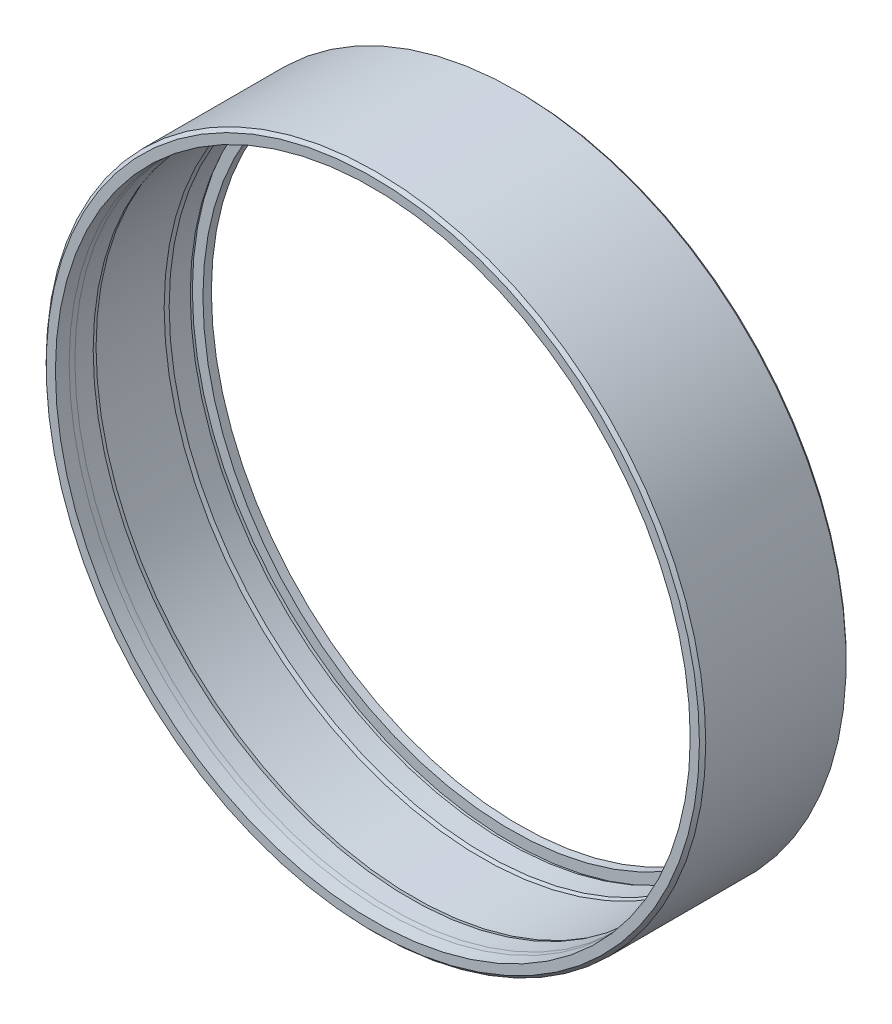
ISO-10303-21;
HEADER;
FILE_DESCRIPTION(('STEP AP214'),'2;1');
FILE_NAME('part.step','',(''),(''),'','','');
FILE_SCHEMA(('AUTOMOTIVE_DESIGN { 1 0 10303 214 1 1 1 1 }'));
ENDSEC;
DATA;
#1=APPLICATION_CONTEXT('core data for automotive mechanical design processes');
#2=APPLICATION_PROTOCOL_DEFINITION('international standard','automotive_design',2000,#1);
#3=PRODUCT_CONTEXT('',#1,'mechanical');
#4=PRODUCT('Part','Part','',(#3));
#5=PRODUCT_RELATED_PRODUCT_CATEGORY('part','',(#4));
#6=PRODUCT_DEFINITION_FORMATION('','',#4);
#7=PRODUCT_DEFINITION_CONTEXT('part definition',#1,'design');
#8=PRODUCT_DEFINITION('design','',#6,#7);
#9=PRODUCT_DEFINITION_SHAPE('','',#8);
#10=(LENGTH_UNIT() NAMED_UNIT(*) SI_UNIT(.MILLI.,.METRE.));
#11=(NAMED_UNIT(*) PLANE_ANGLE_UNIT() SI_UNIT($,.RADIAN.));
#12=(NAMED_UNIT(*) SI_UNIT($,.STERADIAN.) SOLID_ANGLE_UNIT());
#13=UNCERTAINTY_MEASURE_WITH_UNIT(LENGTH_MEASURE(1.E-05),#10,'distance_accuracy_value','');
#14=(GEOMETRIC_REPRESENTATION_CONTEXT(3) GLOBAL_UNCERTAINTY_ASSIGNED_CONTEXT((#13)) GLOBAL_UNIT_ASSIGNED_CONTEXT((#10,
#11,#12)) REPRESENTATION_CONTEXT('',''));
#15=CARTESIAN_POINT('',(0.,0.,0.));
#16=DIRECTION('',(0.,0.,1.));
#17=DIRECTION('',(1.,0.,0.));
#18=AXIS2_PLACEMENT_3D('',#15,#16,#17);
#19=CARTESIAN_POINT('',(0.,0.,-88.9900000000239));
#20=DIRECTION('',(0.,0.,-1.));
#21=DIRECTION('',(-1.,0.,0.));
#22=AXIS2_PLACEMENT_3D('',#19,#20,#21);
#23=CYLINDRICAL_SURFACE('',#22,30.1);
#24=CARTESIAN_POINT('',(0.,0.,-27.3267949192431));
#25=DIRECTION('',(0.,0.,-1.));
#26=DIRECTION('',(-1.,0.,0.));
#27=AXIS2_PLACEMENT_3D('',#24,#25,#26);
#28=CIRCLE('',#27,30.1);
#29=CARTESIAN_POINT('',(-30.1,0.,-27.3267949192431));
#30=VERTEX_POINT('',#29);
#31=EDGE_CURVE('E75',#30,#30,#28,.T.);
#32=ORIENTED_EDGE('',*,*,#31,.T.);
#33=EDGE_LOOP('',(#32));
#34=FACE_BOUND('',#33,.T.);
#35=CARTESIAN_POINT('',(0.,0.,-20.8732050807569));
#36=DIRECTION('',(0.,0.,-1.));
#37=DIRECTION('',(-1.,0.,0.));
#38=AXIS2_PLACEMENT_3D('',#35,#36,#37);
#39=CIRCLE('',#38,30.1);
#40=CARTESIAN_POINT('',(-30.1,0.,-20.8732050807569));
#41=VERTEX_POINT('',#40);
#42=EDGE_CURVE('E111',#41,#41,#39,.T.);
#43=ORIENTED_EDGE('',*,*,#42,.F.);
#44=EDGE_LOOP('',(#43));
#45=FACE_BOUND('',#44,.T.);
#46=ADVANCED_FACE('F41',(#34,#45),#23,.F.);
#47=CARTESIAN_POINT('',(0.,0.,-27.3267949192431));
#48=DIRECTION('',(0.,0.,1.));
#49=DIRECTION('',(1.,0.,0.));
#50=AXIS2_PLACEMENT_3D('',#47,#48,#49);
#51=CONICAL_SURFACE('',#50,30.1,0.261799387799147);
#52=CARTESIAN_POINT('',(0.,0.,-27.7));
#53=DIRECTION('',(0.,0.,-1.));
#54=DIRECTION('',(-1.,0.,0.));
#55=AXIS2_PLACEMENT_3D('',#52,#53,#54);
#56=CIRCLE('',#55,30.);
#57=CARTESIAN_POINT('',(-30.,0.,-27.7));
#58=VERTEX_POINT('',#57);
#59=EDGE_CURVE('E79',#58,#58,#56,.T.);
#60=ORIENTED_EDGE('',*,*,#59,.T.);
#61=EDGE_LOOP('',(#60));
#62=FACE_BOUND('',#61,.T.);
#63=ORIENTED_EDGE('',*,*,#31,.F.);
#64=EDGE_LOOP('',(#63));
#65=FACE_BOUND('',#64,.T.);
#66=ADVANCED_FACE('F121',(#62,#65),#51,.F.);
#67=CARTESIAN_POINT('',(0.,0.,-88.9900000000239));
#68=DIRECTION('',(0.,0.,-1.));
#69=DIRECTION('',(-1.,0.,0.));
#70=AXIS2_PLACEMENT_3D('',#67,#68,#69);
#71=CYLINDRICAL_SURFACE('',#70,30.);
#72=CARTESIAN_POINT('',(0.,0.,-29.7));
#73=DIRECTION('',(0.,0.,-1.));
#74=DIRECTION('',(-1.,0.,0.));
#75=AXIS2_PLACEMENT_3D('',#72,#73,#74);
#76=CIRCLE('',#75,30.);
#77=CARTESIAN_POINT('',(-30.,0.,-29.7));
#78=VERTEX_POINT('',#77);
#79=EDGE_CURVE('E83',#78,#78,#76,.T.);
#80=ORIENTED_EDGE('',*,*,#79,.T.);
#81=EDGE_LOOP('',(#80));
#82=FACE_BOUND('',#81,.T.);
#83=ORIENTED_EDGE('',*,*,#59,.F.);
#84=EDGE_LOOP('',(#83));
#85=FACE_BOUND('',#84,.T.);
#86=ADVANCED_FACE('F127',(#82,#85),#71,.F.);
#87=CARTESIAN_POINT('',(0.,30.,-29.7));
#88=DIRECTION('',(0.,0.,-1.));
#89=DIRECTION('',(-1.,0.,0.));
#90=AXIS2_PLACEMENT_3D('',#87,#88,#89);
#91=PLANE('',#90);
#92=CARTESIAN_POINT('',(0.,0.,-29.7));
#93=DIRECTION('',(0.,0.,-1.));
#94=DIRECTION('',(-1.,0.,0.));
#95=AXIS2_PLACEMENT_3D('',#92,#93,#94);
#96=CIRCLE('',#95,30.2);
#97=CARTESIAN_POINT('',(-30.2,0.,-29.7));
#98=VERTEX_POINT('',#97);
#99=EDGE_CURVE('E87',#98,#98,#96,.T.);
#100=ORIENTED_EDGE('',*,*,#99,.T.);
#101=EDGE_LOOP('',(#100));
#102=FACE_BOUND('',#101,.T.);
#103=ORIENTED_EDGE('',*,*,#79,.F.);
#104=EDGE_LOOP('',(#103));
#105=FACE_BOUND('',#104,.T.);
#106=ADVANCED_FACE('F180',(#102,#105),#91,.T.);
#107=CARTESIAN_POINT('',(0.,0.,-88.9900000000239));
#108=DIRECTION('',(0.,0.,-1.));
#109=DIRECTION('',(-1.,0.,0.));
#110=AXIS2_PLACEMENT_3D('',#107,#108,#109);
#111=CYLINDRICAL_SURFACE('',#110,30.2);
#112=CARTESIAN_POINT('',(0.,0.,-30.1));
#113=DIRECTION('',(0.,0.,-1.));
#114=DIRECTION('',(-1.,0.,0.));
#115=AXIS2_PLACEMENT_3D('',#112,#113,#114);
#116=CIRCLE('',#115,30.2);
#117=CARTESIAN_POINT('',(-30.2,0.,-30.1));
#118=VERTEX_POINT('',#117);
#119=EDGE_CURVE('E91',#118,#118,#116,.T.);
#120=ORIENTED_EDGE('',*,*,#119,.T.);
#121=EDGE_LOOP('',(#120));
#122=FACE_BOUND('',#121,.T.);
#123=ORIENTED_EDGE('',*,*,#99,.F.);
#124=EDGE_LOOP('',(#123));
#125=FACE_BOUND('',#124,.T.);
#126=ADVANCED_FACE('F176',(#122,#125),#111,.F.);
#127=CARTESIAN_POINT('',(0.,30.2,-30.1));
#128=DIRECTION('',(0.,0.,1.));
#129=DIRECTION('',(1.,0.,0.));
#130=AXIS2_PLACEMENT_3D('',#127,#128,#129);
#131=PLANE('',#130);
#132=CARTESIAN_POINT('',(0.,0.,-30.1));
#133=DIRECTION('',(0.,0.,-1.));
#134=DIRECTION('',(-1.,0.,0.));
#135=AXIS2_PLACEMENT_3D('',#132,#133,#134);
#136=CIRCLE('',#135,29.2);
#137=CARTESIAN_POINT('',(-29.2,0.,-30.1));
#138=VERTEX_POINT('',#137);
#139=EDGE_CURVE('E95',#138,#138,#136,.T.);
#140=ORIENTED_EDGE('',*,*,#139,.T.);
#141=EDGE_LOOP('',(#140));
#142=FACE_BOUND('',#141,.T.);
#143=ORIENTED_EDGE('',*,*,#119,.F.);
#144=EDGE_LOOP('',(#143));
#145=FACE_BOUND('',#144,.T.);
#146=ADVANCED_FACE('F172',(#142,#145),#131,.T.);
#147=CARTESIAN_POINT('',(0.,0.,-88.9900000000239));
#148=DIRECTION('',(0.,0.,-1.));
#149=DIRECTION('',(-1.,0.,0.));
#150=AXIS2_PLACEMENT_3D('',#147,#148,#149);
#151=CYLINDRICAL_SURFACE('',#150,29.2);
#152=CARTESIAN_POINT('',(0.,0.,-30.9));
#153=DIRECTION('',(0.,0.,-1.));
#154=DIRECTION('',(-1.,0.,0.));
#155=AXIS2_PLACEMENT_3D('',#152,#153,#154);
#156=CIRCLE('',#155,29.2);
#157=CARTESIAN_POINT('',(-29.2,0.,-30.9));
#158=VERTEX_POINT('',#157);
#159=EDGE_CURVE('E99',#158,#158,#156,.T.);
#160=ORIENTED_EDGE('',*,*,#159,.T.);
#161=EDGE_LOOP('',(#160));
#162=FACE_BOUND('',#161,.T.);
#163=ORIENTED_EDGE('',*,*,#139,.F.);
#164=EDGE_LOOP('',(#163));
#165=FACE_BOUND('',#164,.T.);
#166=ADVANCED_FACE('F165',(#162,#165),#151,.F.);
#167=CARTESIAN_POINT('',(0.,29.2,-30.9));
#168=DIRECTION('',(0.,0.,-1.));
#169=DIRECTION('',(-1.,0.,0.));
#170=AXIS2_PLACEMENT_3D('',#167,#168,#169);
#171=PLANE('',#170);
#172=CARTESIAN_POINT('',(0.,0.,-30.9));
#173=DIRECTION('',(0.,0.,-1.));
#174=DIRECTION('',(-1.,0.,0.));
#175=AXIS2_PLACEMENT_3D('',#172,#173,#174);
#176=CIRCLE('',#175,30.95);
#177=CARTESIAN_POINT('',(-30.95,0.,-30.9));
#178=VERTEX_POINT('',#177);
#179=EDGE_CURVE('E71',#178,#178,#176,.T.);
#180=ORIENTED_EDGE('',*,*,#179,.T.);
#181=EDGE_LOOP('',(#180));
#182=FACE_BOUND('',#181,.T.);
#183=ORIENTED_EDGE('',*,*,#159,.F.);
#184=EDGE_LOOP('',(#183));
#185=FACE_BOUND('',#184,.T.);
#186=ADVANCED_FACE('F155',(#182,#185),#171,.T.);
#187=CARTESIAN_POINT('',(0.,0.,-88.9900000000239));
#188=DIRECTION('',(0.,0.,-1.));
#189=DIRECTION('',(-1.,0.,0.));
#190=AXIS2_PLACEMENT_3D('',#187,#188,#189);
#191=CYLINDRICAL_SURFACE('',#190,31.25);
#192=CARTESIAN_POINT('',(0.,0.,-30.6));
#193=DIRECTION('',(0.,0.,-1.));
#194=DIRECTION('',(-1.,0.,0.));
#195=AXIS2_PLACEMENT_3D('',#192,#193,#194);
#196=CIRCLE('',#195,31.25);
#197=CARTESIAN_POINT('',(-31.25,0.,-30.6));
#198=VERTEX_POINT('',#197);
#199=EDGE_CURVE('E62',#198,#198,#196,.F.);
#200=ORIENTED_EDGE('',*,*,#199,.T.);
#201=EDGE_LOOP('',(#200));
#202=FACE_BOUND('',#201,.T.);
#203=CARTESIAN_POINT('',(0.,0.,-17.3));
#204=DIRECTION('',(0.,0.,1.));
#205=DIRECTION('',(1.,0.,0.));
#206=AXIS2_PLACEMENT_3D('',#203,#204,#205);
#207=CIRCLE('',#206,31.25);
#208=CARTESIAN_POINT('',(31.25,0.,-17.3));
#209=VERTEX_POINT('',#208);
#210=EDGE_CURVE('E68',#209,#209,#207,.F.);
#211=ORIENTED_EDGE('',*,*,#210,.T.);
#212=EDGE_LOOP('',(#211));
#213=FACE_BOUND('',#212,.T.);
#214=ADVANCED_FACE('F152',(#202,#213),#191,.T.);
#215=CARTESIAN_POINT('',(0.,31.25,-17.));
#216=DIRECTION('',(0.,0.,1.));
#217=DIRECTION('',(1.,0.,0.));
#218=AXIS2_PLACEMENT_3D('',#215,#216,#217);
#219=PLANE('',#218);
#220=CARTESIAN_POINT('',(0.,0.,-17.));
#221=DIRECTION('',(0.,0.,1.));
#222=DIRECTION('',(1.,0.,0.));
#223=AXIS2_PLACEMENT_3D('',#220,#221,#222);
#224=CIRCLE('',#223,30.95);
#225=CARTESIAN_POINT('',(30.95,0.,-17.));
#226=VERTEX_POINT('',#225);
#227=EDGE_CURVE('E56',#226,#226,#224,.T.);
#228=ORIENTED_EDGE('',*,*,#227,.T.);
#229=EDGE_LOOP('',(#228));
#230=FACE_BOUND('',#229,.T.);
#231=CARTESIAN_POINT('',(0.,0.,-17.));
#232=DIRECTION('',(0.,0.,-1.));
#233=DIRECTION('',(-1.,0.,0.));
#234=AXIS2_PLACEMENT_3D('',#231,#232,#233);
#235=CIRCLE('',#234,30.0786116689246);
#236=CARTESIAN_POINT('',(-30.0786116689246,0.,-17.));
#237=VERTEX_POINT('',#236);
#238=EDGE_CURVE('E103',#237,#237,#235,.T.);
#239=ORIENTED_EDGE('',*,*,#238,.T.);
#240=EDGE_LOOP('',(#239));
#241=FACE_BOUND('',#240,.T.);
#242=ADVANCED_FACE('F154',(#230,#241),#219,.T.);
#243=CARTESIAN_POINT('',(0.,0.,-17.));
#244=DIRECTION('',(0.,0.,1.));
#245=DIRECTION('',(1.,0.,0.));
#246=AXIS2_PLACEMENT_3D('',#243,#244,#245);
#247=CONICAL_SURFACE('',#246,30.0786116689246,0.0523598775598269);
#248=CARTESIAN_POINT('',(0.,0.,-18.2384996532624));
#249=DIRECTION('',(0.,0.,-1.));
#250=DIRECTION('',(-1.,0.,0.));
#251=AXIS2_PLACEMENT_3D('',#248,#249,#250);
#252=CIRCLE('',#251,30.0137046524543);
#253=CARTESIAN_POINT('',(-30.0137046524543,0.,-18.2384996532624));
#254=VERTEX_POINT('',#253);
#255=EDGE_CURVE('E49',#254,#254,#252,.T.);
#256=ORIENTED_EDGE('',*,*,#255,.T.);
#257=EDGE_LOOP('',(#256));
#258=FACE_BOUND('',#257,.T.);
#259=ORIENTED_EDGE('',*,*,#238,.F.);
#260=EDGE_LOOP('',(#259));
#261=FACE_BOUND('',#260,.T.);
#262=ADVANCED_FACE('F162',(#258,#261),#247,.F.);
#263=CARTESIAN_POINT('',(0.,0.,-88.9900000000239));
#264=DIRECTION('',(0.,0.,-1.));
#265=DIRECTION('',(-1.,0.,0.));
#266=AXIS2_PLACEMENT_3D('',#263,#264,#265);
#267=CYLINDRICAL_SURFACE('',#266,30.);
#268=CARTESIAN_POINT('',(0.,0.,-18.7618592156918));
#269=DIRECTION('',(0.,0.,1.));
#270=DIRECTION('',(1.,0.,0.));
#271=AXIS2_PLACEMENT_3D('',#268,#269,#270);
#272=CIRCLE('',#271,30.);
#273=CARTESIAN_POINT('',(30.,0.,-18.7618592156918));
#274=VERTEX_POINT('',#273);
#275=EDGE_CURVE('E10',#274,#274,#272,.T.);
#276=ORIENTED_EDGE('',*,*,#275,.T.);
#277=EDGE_LOOP('',(#276));
#278=FACE_BOUND('',#277,.T.);
#279=CARTESIAN_POINT('',(0.,0.,-20.5));
#280=DIRECTION('',(0.,0.,-1.));
#281=DIRECTION('',(-1.,0.,0.));
#282=AXIS2_PLACEMENT_3D('',#279,#280,#281);
#283=CIRCLE('',#282,30.);
#284=CARTESIAN_POINT('',(-30.,0.,-20.5));
#285=VERTEX_POINT('',#284);
#286=EDGE_CURVE('E107',#285,#285,#283,.T.);
#287=ORIENTED_EDGE('',*,*,#286,.T.);
#288=EDGE_LOOP('',(#287));
#289=FACE_BOUND('',#288,.T.);
#290=ADVANCED_FACE('F237',(#278,#289),#267,.F.);
#291=CARTESIAN_POINT('',(0.,0.,-20.5));
#292=DIRECTION('',(0.,0.,-1.));
#293=DIRECTION('',(-1.,0.,0.));
#294=AXIS2_PLACEMENT_3D('',#291,#292,#293);
#295=CONICAL_SURFACE('',#294,30.,0.261799387799147);
#296=ORIENTED_EDGE('',*,*,#42,.T.);
#297=EDGE_LOOP('',(#296));
#298=FACE_BOUND('',#297,.T.);
#299=ORIENTED_EDGE('',*,*,#286,.F.);
#300=EDGE_LOOP('',(#299));
#301=FACE_BOUND('',#300,.T.);
#302=ADVANCED_FACE('F117',(#298,#301),#295,.F.);
#303=CARTESIAN_POINT('',(0.,0.,-30.9));
#304=DIRECTION('',(0.,0.,1.));
#305=DIRECTION('',(1.,0.,0.));
#306=AXIS2_PLACEMENT_3D('',#303,#304,#305);
#307=CONICAL_SURFACE('',#306,30.95,0.785398163397471);
#308=ORIENTED_EDGE('',*,*,#199,.F.);
#309=EDGE_LOOP('',(#308));
#310=FACE_BOUND('',#309,.T.);
#311=ORIENTED_EDGE('',*,*,#179,.F.);
#312=EDGE_LOOP('',(#311));
#313=FACE_BOUND('',#312,.T.);
#314=ADVANCED_FACE('F133',(#310,#313),#307,.T.);
#315=CARTESIAN_POINT('',(0.,0.,-17.3));
#316=DIRECTION('',(0.,0.,-1.));
#317=DIRECTION('',(-1.,0.,0.));
#318=AXIS2_PLACEMENT_3D('',#315,#316,#317);
#319=CONICAL_SURFACE('',#318,31.25,0.785398163397437);
#320=ORIENTED_EDGE('',*,*,#227,.F.);
#321=EDGE_LOOP('',(#320));
#322=FACE_BOUND('',#321,.T.);
#323=ORIENTED_EDGE('',*,*,#210,.F.);
#324=EDGE_LOOP('',(#323));
#325=FACE_BOUND('',#324,.T.);
#326=ADVANCED_FACE('F138',(#322,#325),#319,.T.);
#327=CARTESIAN_POINT('',(0.,0.,-18.7618592156918));
#328=DIRECTION('',(0.,0.,1.));
#329=DIRECTION('',(1.,0.,0.));
#330=AXIS2_PLACEMENT_3D('',#327,#328,#329);
#331=TOROIDAL_SURFACE('',#330,40.,10.);
#332=ORIENTED_EDGE('',*,*,#275,.F.);
#333=EDGE_LOOP('',(#332));
#334=FACE_BOUND('',#333,.T.);
#335=ORIENTED_EDGE('',*,*,#255,.F.);
#336=EDGE_LOOP('',(#335));
#337=FACE_BOUND('',#336,.T.);
#338=ADVANCED_FACE('F43',(#334,#337),#331,.T.);
#339=CLOSED_SHELL('',(#46,#66,#86,#106,#126,#146,#166,#186,#214,#242,#262,#290,#302,#314,#326,#338));
#340=MANIFOLD_SOLID_BREP('B2',#339);
#341=ADVANCED_BREP_SHAPE_REPRESENTATION('',(#18,#340),#14);
#342=SHAPE_DEFINITION_REPRESENTATION(#9,#341);
ENDSEC;
END-ISO-10303-21;
